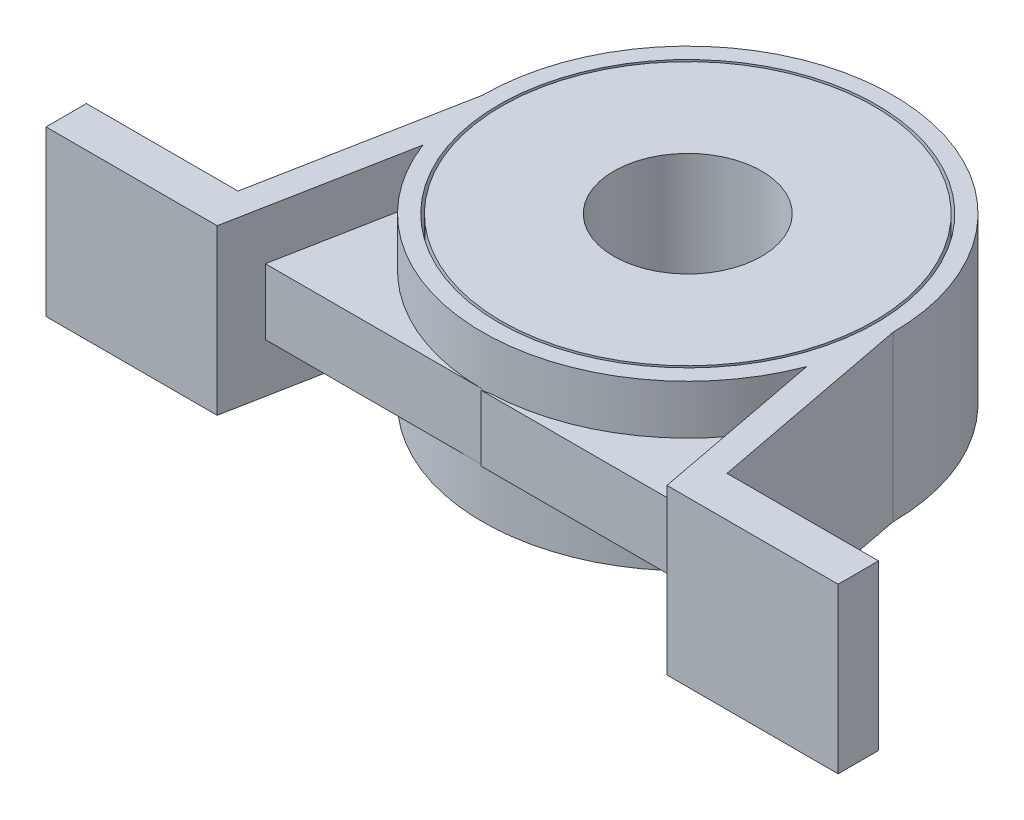
ISO-10303-21;
HEADER;
FILE_DESCRIPTION(('STEP AP214'),'2;1');
FILE_NAME('part.step','',(''),(''),'','','');
FILE_SCHEMA(('AUTOMOTIVE_DESIGN { 1 0 10303 214 1 1 1 1 }'));
ENDSEC;
DATA;
#1=APPLICATION_CONTEXT('core data for automotive mechanical design processes');
#2=APPLICATION_PROTOCOL_DEFINITION('international standard','automotive_design',2000,#1);
#3=PRODUCT_CONTEXT('',#1,'mechanical');
#4=PRODUCT('Part','Part','',(#3));
#5=PRODUCT_RELATED_PRODUCT_CATEGORY('part','',(#4));
#6=PRODUCT_DEFINITION_FORMATION('','',#4);
#7=PRODUCT_DEFINITION_CONTEXT('part definition',#1,'design');
#8=PRODUCT_DEFINITION('design','',#6,#7);
#9=PRODUCT_DEFINITION_SHAPE('','',#8);
#10=(LENGTH_UNIT() NAMED_UNIT(*) SI_UNIT(.MILLI.,.METRE.));
#11=(NAMED_UNIT(*) PLANE_ANGLE_UNIT() SI_UNIT($,.RADIAN.));
#12=(NAMED_UNIT(*) SI_UNIT($,.STERADIAN.) SOLID_ANGLE_UNIT());
#13=UNCERTAINTY_MEASURE_WITH_UNIT(LENGTH_MEASURE(1.E-05),#10,'distance_accuracy_value','');
#14=(GEOMETRIC_REPRESENTATION_CONTEXT(3) GLOBAL_UNCERTAINTY_ASSIGNED_CONTEXT((#13)) GLOBAL_UNIT_ASSIGNED_CONTEXT((#10,
#11,#12)) REPRESENTATION_CONTEXT('',''));
#15=CARTESIAN_POINT('',(0.,0.,0.));
#16=DIRECTION('',(0.,0.,1.));
#17=DIRECTION('',(1.,0.,0.));
#18=AXIS2_PLACEMENT_3D('',#15,#16,#17);
#19=CARTESIAN_POINT('',(0.,-5.,0.));
#20=DIRECTION('',(0.,1.,0.));
#21=DIRECTION('',(0.,0.,1.));
#22=AXIS2_PLACEMENT_3D('',#19,#20,#21);
#23=CYLINDRICAL_SURFACE('',#22,11.3415816445115);
#24=CARTESIAN_POINT('',(0.,-5.,0.));
#25=DIRECTION('',(0.,1.,0.));
#26=DIRECTION('',(0.,0.,1.));
#27=AXIS2_PLACEMENT_3D('',#24,#25,#26);
#28=CIRCLE('',#27,11.3415816445115);
#29=CARTESIAN_POINT('',(0.,-5.,11.3415816445115));
#30=VERTEX_POINT('',#29);
#31=EDGE_CURVE('E11',#30,#30,#28,.T.);
#32=ORIENTED_EDGE('',*,*,#31,.T.);
#33=EDGE_LOOP('',(#32));
#34=FACE_BOUND('',#33,.T.);
#35=CARTESIAN_POINT('',(0.,5.,0.));
#36=DIRECTION('',(0.,1.,0.));
#37=DIRECTION('',(0.,0.,1.));
#38=AXIS2_PLACEMENT_3D('',#35,#36,#37);
#39=CIRCLE('',#38,11.3415816445115);
#40=CARTESIAN_POINT('',(0.,5.,11.3415816445115));
#41=VERTEX_POINT('',#40);
#42=EDGE_CURVE('E56',#41,#41,#39,.T.);
#43=ORIENTED_EDGE('',*,*,#42,.F.);
#44=EDGE_LOOP('',(#43));
#45=FACE_BOUND('',#44,.T.);
#46=ADVANCED_FACE('F49',(#34,#45),#23,.T.);
#47=CARTESIAN_POINT('',(0.,-5.,0.));
#48=DIRECTION('',(0.,1.,0.));
#49=DIRECTION('',(0.,0.,1.));
#50=AXIS2_PLACEMENT_3D('',#47,#48,#49);
#51=PLANE('',#50);
#52=ORIENTED_EDGE('',*,*,#31,.F.);
#53=EDGE_LOOP('',(#52));
#54=FACE_BOUND('',#53,.T.);
#55=CARTESIAN_POINT('',(0.,-5.,0.));
#56=DIRECTION('',(0.,1.,0.));
#57=DIRECTION('',(0.,0.,1.));
#58=AXIS2_PLACEMENT_3D('',#55,#56,#57);
#59=CIRCLE('',#58,5.);
#60=CARTESIAN_POINT('',(0.,-5.,5.));
#61=VERTEX_POINT('',#60);
#62=EDGE_CURVE('E61',#61,#61,#59,.T.);
#63=ORIENTED_EDGE('',*,*,#62,.T.);
#64=EDGE_LOOP('',(#63));
#65=FACE_BOUND('',#64,.T.);
#66=ADVANCED_FACE('F86',(#54,#65),#51,.F.);
#67=CARTESIAN_POINT('',(0.,5.,0.));
#68=DIRECTION('',(0.,1.,0.));
#69=DIRECTION('',(0.,0.,1.));
#70=AXIS2_PLACEMENT_3D('',#67,#68,#69);
#71=PLANE('',#70);
#72=ORIENTED_EDGE('',*,*,#42,.T.);
#73=EDGE_LOOP('',(#72));
#74=FACE_BOUND('',#73,.T.);
#75=CARTESIAN_POINT('',(0.,5.,0.));
#76=DIRECTION('',(0.,1.,0.));
#77=DIRECTION('',(0.,0.,1.));
#78=AXIS2_PLACEMENT_3D('',#75,#76,#77);
#79=CIRCLE('',#78,4.5);
#80=CARTESIAN_POINT('',(0.,5.,4.5));
#81=VERTEX_POINT('',#80);
#82=EDGE_CURVE('E76',#81,#81,#79,.T.);
#83=ORIENTED_EDGE('',*,*,#82,.F.);
#84=EDGE_LOOP('',(#83));
#85=FACE_BOUND('',#84,.T.);
#86=ADVANCED_FACE('F83',(#74,#85),#71,.T.);
#87=CARTESIAN_POINT('',(0.,-8.,0.));
#88=DIRECTION('',(0.,1.,0.));
#89=DIRECTION('',(0.,0.,1.));
#90=AXIS2_PLACEMENT_3D('',#87,#88,#89);
#91=CYLINDRICAL_SURFACE('',#90,5.);
#92=CARTESIAN_POINT('',(0.,-8.,0.));
#93=DIRECTION('',(0.,1.,0.));
#94=DIRECTION('',(0.,0.,1.));
#95=AXIS2_PLACEMENT_3D('',#92,#93,#94);
#96=CIRCLE('',#95,5.);
#97=CARTESIAN_POINT('',(0.,-8.,5.));
#98=VERTEX_POINT('',#97);
#99=EDGE_CURVE('E66',#98,#98,#96,.T.);
#100=ORIENTED_EDGE('',*,*,#99,.T.);
#101=EDGE_LOOP('',(#100));
#102=FACE_BOUND('',#101,.T.);
#103=ORIENTED_EDGE('',*,*,#62,.F.);
#104=EDGE_LOOP('',(#103));
#105=FACE_BOUND('',#104,.T.);
#106=ADVANCED_FACE('F85',(#102,#105),#91,.T.);
#107=CARTESIAN_POINT('',(0.,-8.,0.));
#108=DIRECTION('',(0.,1.,0.));
#109=DIRECTION('',(0.,0.,1.));
#110=AXIS2_PLACEMENT_3D('',#107,#108,#109);
#111=PLANE('',#110);
#112=CARTESIAN_POINT('',(0.,-8.,0.));
#113=DIRECTION('',(0.,1.,0.));
#114=DIRECTION('',(0.,0.,1.));
#115=AXIS2_PLACEMENT_3D('',#112,#113,#114);
#116=CIRCLE('',#115,4.5);
#117=CARTESIAN_POINT('',(0.,-8.,4.5));
#118=VERTEX_POINT('',#117);
#119=EDGE_CURVE('E72',#118,#118,#116,.T.);
#120=ORIENTED_EDGE('',*,*,#119,.T.);
#121=EDGE_LOOP('',(#120));
#122=FACE_BOUND('',#121,.T.);
#123=ORIENTED_EDGE('',*,*,#99,.F.);
#124=EDGE_LOOP('',(#123));
#125=FACE_BOUND('',#124,.T.);
#126=ADVANCED_FACE('F92',(#122,#125),#111,.F.);
#127=CARTESIAN_POINT('',(0.,-8.,0.));
#128=DIRECTION('',(0.,1.,0.));
#129=DIRECTION('',(0.,0.,1.));
#130=AXIS2_PLACEMENT_3D('',#127,#128,#129);
#131=CYLINDRICAL_SURFACE('',#130,4.5);
#132=ORIENTED_EDGE('',*,*,#119,.F.);
#133=EDGE_LOOP('',(#132));
#134=FACE_BOUND('',#133,.T.);
#135=ORIENTED_EDGE('',*,*,#82,.T.);
#136=EDGE_LOOP('',(#135));
#137=FACE_BOUND('',#136,.T.);
#138=ADVANCED_FACE('F81',(#134,#137),#131,.F.);
#139=CLOSED_SHELL('',(#46,#66,#86,#106,#126,#138));
#140=MANIFOLD_SOLID_BREP('B2',#139);
#141=CARTESIAN_POINT('',(0.,-5.,0.));
#142=DIRECTION('',(0.,1.,0.));
#143=DIRECTION('',(0.,0.,1.));
#144=AXIS2_PLACEMENT_3D('',#141,#142,#143);
#145=CYLINDRICAL_SURFACE('',#144,12.5);
#146=CARTESIAN_POINT('',(0.,-2.,0.));
#147=DIRECTION('',(0.,-1.,0.));
#148=DIRECTION('',(0.,0.,-1.));
#149=AXIS2_PLACEMENT_3D('',#146,#147,#148);
#150=CIRCLE('',#149,12.5);
#151=CARTESIAN_POINT('',(0.526660373372982,-2.,12.4889002258453));
#152=VERTEX_POINT('',#151);
#153=CARTESIAN_POINT('',(11.5450602026166,-2.,4.79182480042409));
#154=VERTEX_POINT('',#153);
#155=EDGE_CURVE('E47',#152,#154,#150,.F.);
#156=ORIENTED_EDGE('',*,*,#155,.F.);
#157=DIRECTION('',(0.,1.,0.));
#158=VECTOR('',#157,1.);
#159=CARTESIAN_POINT('',(0.526660373372982,-2.,12.4889002258453));
#160=LINE('',#159,#158);
#161=CARTESIAN_POINT('',(0.526660373372982,2.,12.4889002258453));
#162=VERTEX_POINT('',#161);
#163=EDGE_CURVE('E492',#162,#152,#160,.F.);
#164=ORIENTED_EDGE('',*,*,#163,.F.);
#165=CARTESIAN_POINT('',(0.,2.,0.));
#166=DIRECTION('',(0.,-1.,0.));
#167=DIRECTION('',(0.,0.,-1.));
#168=AXIS2_PLACEMENT_3D('',#165,#166,#167);
#169=CIRCLE('',#168,12.5);
#170=CARTESIAN_POINT('',(11.5450602026166,2.,4.79182480042409));
#171=VERTEX_POINT('',#170);
#172=EDGE_CURVE('E465',#162,#171,#169,.F.);
#173=ORIENTED_EDGE('',*,*,#172,.T.);
#174=DIRECTION('',(0.,1.,0.));
#175=VECTOR('',#174,1.);
#176=CARTESIAN_POINT('',(11.5450602026166,-2.,4.79182480042409));
#177=LINE('',#176,#175);
#178=EDGE_CURVE('E164',#154,#171,#177,.T.);
#179=ORIENTED_EDGE('',*,*,#178,.F.);
#180=EDGE_LOOP('',(#156,#164,#173,#179));
#181=FACE_BOUND('',#180,.T.);
#182=DIRECTION('',(0.,1.,0.));
#183=VECTOR('',#182,1.);
#184=CARTESIAN_POINT('',(11.684129612312,-5.,4.44197199481196));
#185=LINE('',#184,#183);
#186=CARTESIAN_POINT('',(11.684129612312,-5.,4.44197199481196));
#187=VERTEX_POINT('',#186);
#188=CARTESIAN_POINT('',(11.684129612312,-2.,4.44197199481196));
#189=VERTEX_POINT('',#188);
#190=EDGE_CURVE('E474',#187,#189,#185,.T.);
#191=ORIENTED_EDGE('',*,*,#190,.T.);
#192=DIRECTION('',(0.,1.,0.));
#193=VECTOR('',#192,1.);
#194=CARTESIAN_POINT('',(11.684129612312,-2.,4.44197199481196));
#195=LINE('',#194,#193);
#196=CARTESIAN_POINT('',(11.684129612312,2.,4.44197199481196));
#197=VERTEX_POINT('',#196);
#198=EDGE_CURVE('E379',#189,#197,#195,.T.);
#199=ORIENTED_EDGE('',*,*,#198,.T.);
#200=CARTESIAN_POINT('',(11.684129612312,5.,4.44197199481196));
#201=VERTEX_POINT('',#200);
#202=EDGE_CURVE('E477',#197,#201,#185,.T.);
#203=ORIENTED_EDGE('',*,*,#202,.T.);
#204=CARTESIAN_POINT('',(0.,5.,0.));
#205=DIRECTION('',(0.,1.,0.));
#206=DIRECTION('',(0.,0.,1.));
#207=AXIS2_PLACEMENT_3D('',#204,#205,#206);
#208=CIRCLE('',#207,12.5);
#209=CARTESIAN_POINT('',(-11.684129612312,5.,4.44197199481197));
#210=VERTEX_POINT('',#209);
#211=EDGE_CURVE('E407',#210,#201,#208,.T.);
#212=ORIENTED_EDGE('',*,*,#211,.F.);
#213=DIRECTION('',(0.,1.,0.));
#214=VECTOR('',#213,1.);
#215=CARTESIAN_POINT('',(-11.684129612312,-5.,4.44197199481197));
#216=LINE('',#215,#214);
#217=CARTESIAN_POINT('',(-11.684129612312,2.,4.44197199481197));
#218=VERTEX_POINT('',#217);
#219=EDGE_CURVE('E480',#218,#210,#216,.T.);
#220=ORIENTED_EDGE('',*,*,#219,.F.);
#221=DIRECTION('',(0.,1.,0.));
#222=VECTOR('',#221,1.);
#223=CARTESIAN_POINT('',(-11.684129612312,-2.,4.44197199481197));
#224=LINE('',#223,#222);
#225=CARTESIAN_POINT('',(-11.684129612312,-2.,4.44197199481197));
#226=VERTEX_POINT('',#225);
#227=EDGE_CURVE('E307',#226,#218,#224,.T.);
#228=ORIENTED_EDGE('',*,*,#227,.F.);
#229=CARTESIAN_POINT('',(-11.684129612312,-5.,4.44197199481197));
#230=VERTEX_POINT('',#229);
#231=EDGE_CURVE('E478',#230,#226,#216,.T.);
#232=ORIENTED_EDGE('',*,*,#231,.F.);
#233=CARTESIAN_POINT('',(0.,-5.,0.));
#234=DIRECTION('',(0.,1.,0.));
#235=DIRECTION('',(0.,0.,1.));
#236=AXIS2_PLACEMENT_3D('',#233,#234,#235);
#237=CIRCLE('',#236,12.5);
#238=EDGE_CURVE('E445',#230,#187,#237,.T.);
#239=ORIENTED_EDGE('',*,*,#238,.T.);
#240=EDGE_LOOP('',(#191,#199,#203,#212,#220,#228,#232,#239));
#241=FACE_BOUND('',#240,.T.);
#242=DIRECTION('',(0.,1.,0.));
#243=VECTOR('',#242,1.);
#244=CARTESIAN_POINT('',(0.,-2.,12.5));
#245=LINE('',#244,#243);
#246=CARTESIAN_POINT('',(0.,-2.,12.5));
#247=VERTEX_POINT('',#246);
#248=CARTESIAN_POINT('',(0.,2.,12.5));
#249=VERTEX_POINT('',#248);
#250=EDGE_CURVE('E176',#247,#249,#245,.T.);
#251=ORIENTED_EDGE('',*,*,#250,.F.);
#252=CARTESIAN_POINT('',(0.,-2.,0.));
#253=DIRECTION('',(0.,1.,0.));
#254=DIRECTION('',(0.,0.,1.));
#255=AXIS2_PLACEMENT_3D('',#252,#253,#254);
#256=CIRCLE('',#255,12.5);
#257=CARTESIAN_POINT('',(-10.4298531818956,-2.,6.88971426142638));
#258=VERTEX_POINT('',#257);
#259=EDGE_CURVE('E171',#247,#258,#256,.F.);
#260=ORIENTED_EDGE('',*,*,#259,.T.);
#261=DIRECTION('',(0.,1.,0.));
#262=VECTOR('',#261,1.);
#263=CARTESIAN_POINT('',(-10.4298531818956,-2.,6.88971426142638));
#264=LINE('',#263,#262);
#265=CARTESIAN_POINT('',(-10.4298531818956,2.,6.88971426142638));
#266=VERTEX_POINT('',#265);
#267=EDGE_CURVE('E509',#266,#258,#264,.F.);
#268=ORIENTED_EDGE('',*,*,#267,.F.);
#269=CARTESIAN_POINT('',(0.,2.,0.));
#270=DIRECTION('',(0.,1.,0.));
#271=DIRECTION('',(0.,0.,1.));
#272=AXIS2_PLACEMENT_3D('',#269,#270,#271);
#273=CIRCLE('',#272,12.5);
#274=EDGE_CURVE('E579',#249,#266,#273,.F.);
#275=ORIENTED_EDGE('',*,*,#274,.F.);
#276=EDGE_LOOP('',(#251,#260,#268,#275));
#277=FACE_BOUND('',#276,.T.);
#278=ADVANCED_FACE('F156',(#181,#241,#277),#145,.T.);
#279=CARTESIAN_POINT('',(-13.6940376471734,-5.,14.9625156708185));
#280=DIRECTION('',(0.982235539022068,0.,0.187652193917438));
#281=DIRECTION('',(0.187652193917438,0.,-0.982235539022068));
#282=AXIS2_PLACEMENT_3D('',#279,#280,#281);
#283=PLANE('',#282);
#284=ORIENTED_EDGE('',*,*,#231,.T.);
#285=DIRECTION('',(-0.187652193917438,0.,0.982235539022068));
#286=VECTOR('',#285,1.);
#287=CARTESIAN_POINT('',(-13.2235838203395,-2.,12.5));
#288=LINE('',#287,#286);
#289=CARTESIAN_POINT('',(-13.2235838203395,-2.,12.5));
#290=VERTEX_POINT('',#289);
#291=EDGE_CURVE('E302',#226,#290,#288,.T.);
#292=ORIENTED_EDGE('',*,*,#291,.T.);
#293=DIRECTION('',(0.,1.,0.));
#294=VECTOR('',#293,1.);
#295=CARTESIAN_POINT('',(-13.2235838203395,-2.,12.5));
#296=LINE('',#295,#294);
#297=CARTESIAN_POINT('',(-13.2235838203395,2.,12.5));
#298=VERTEX_POINT('',#297);
#299=EDGE_CURVE('E295',#290,#298,#296,.T.);
#300=ORIENTED_EDGE('',*,*,#299,.T.);
#301=DIRECTION('',(-0.187652193917438,0.,0.982235539022068));
#302=VECTOR('',#301,1.);
#303=CARTESIAN_POINT('',(-13.2235838203395,2.,12.5));
#304=LINE('',#303,#302);
#305=EDGE_CURVE('E299',#218,#298,#304,.T.);
#306=ORIENTED_EDGE('',*,*,#305,.F.);
#307=ORIENTED_EDGE('',*,*,#219,.T.);
#308=DIRECTION('',(0.187652193917438,0.,-0.982235539022068));
#309=VECTOR('',#308,1.);
#310=CARTESIAN_POINT('',(-13.6940376471734,5.,14.9625156708185));
#311=LINE('',#310,#309);
#312=CARTESIAN_POINT('',(-13.6940376471734,5.,14.9625156708185));
#313=VERTEX_POINT('',#312);
#314=EDGE_CURVE('E404',#313,#210,#311,.T.);
#315=ORIENTED_EDGE('',*,*,#314,.F.);
#316=DIRECTION('',(0.,1.,0.));
#317=VECTOR('',#316,1.);
#318=CARTESIAN_POINT('',(-13.6940376471734,-5.,14.9625156708185));
#319=LINE('',#318,#317);
#320=CARTESIAN_POINT('',(-13.6940376471734,-5.,14.9625156708185));
#321=VERTEX_POINT('',#320);
#322=EDGE_CURVE('E481',#321,#313,#319,.T.);
#323=ORIENTED_EDGE('',*,*,#322,.F.);
#324=DIRECTION('',(0.187652193917438,0.,-0.982235539022068));
#325=VECTOR('',#324,1.);
#326=CARTESIAN_POINT('',(-13.6940376471734,-5.,14.9625156708185));
#327=LINE('',#326,#325);
#328=EDGE_CURVE('E442',#321,#230,#327,.T.);
#329=ORIENTED_EDGE('',*,*,#328,.T.);
#330=EDGE_LOOP('',(#284,#292,#300,#306,#307,#315,#323,#329));
#331=FACE_BOUND('',#330,.T.);
#332=ADVANCED_FACE('F298',(#331),#283,.T.);
#333=CARTESIAN_POINT('',(0.,-5.,0.));
#334=DIRECTION('',(0.,1.,0.));
#335=DIRECTION('',(0.,0.,1.));
#336=AXIS2_PLACEMENT_3D('',#333,#334,#335);
#337=CYLINDRICAL_SURFACE('',#336,12.5);
#338=DIRECTION('',(0.,1.,0.));
#339=VECTOR('',#338,1.);
#340=CARTESIAN_POINT('',(-12.5,-5.,0.));
#341=LINE('',#340,#339);
#342=CARTESIAN_POINT('',(-12.5,-5.,0.));
#343=VERTEX_POINT('',#342);
#344=CARTESIAN_POINT('',(-12.5,5.,0.));
#345=VERTEX_POINT('',#344);
#346=EDGE_CURVE('E462',#343,#345,#341,.T.);
#347=ORIENTED_EDGE('',*,*,#346,.T.);
#348=CARTESIAN_POINT('',(0.,5.,0.));
#349=DIRECTION('',(0.,1.,0.));
#350=DIRECTION('',(0.,0.,1.));
#351=AXIS2_PLACEMENT_3D('',#348,#349,#350);
#352=CIRCLE('',#351,12.5);
#353=CARTESIAN_POINT('',(12.5,5.,0.));
#354=VERTEX_POINT('',#353);
#355=EDGE_CURVE('E389',#354,#345,#352,.T.);
#356=ORIENTED_EDGE('',*,*,#355,.F.);
#357=DIRECTION('',(0.,1.,0.));
#358=VECTOR('',#357,1.);
#359=CARTESIAN_POINT('',(12.5,-5.,0.));
#360=LINE('',#359,#358);
#361=CARTESIAN_POINT('',(12.5,-5.,0.));
#362=VERTEX_POINT('',#361);
#363=EDGE_CURVE('E463',#362,#354,#360,.T.);
#364=ORIENTED_EDGE('',*,*,#363,.F.);
#365=CARTESIAN_POINT('',(0.,-5.,0.));
#366=DIRECTION('',(0.,1.,0.));
#367=DIRECTION('',(0.,0.,1.));
#368=AXIS2_PLACEMENT_3D('',#365,#366,#367);
#369=CIRCLE('',#368,12.5);
#370=EDGE_CURVE('E428',#362,#343,#369,.T.);
#371=ORIENTED_EDGE('',*,*,#370,.T.);
#372=EDGE_LOOP('',(#347,#356,#364,#371));
#373=FACE_BOUND('',#372,.T.);
#374=ADVANCED_FACE('F158',(#373),#337,.T.);
#375=CARTESIAN_POINT('',(12.5,-5.,0.));
#376=DIRECTION('',(0.982235539022068,0.,-0.187652193917437));
#377=DIRECTION('',(-0.187652193917437,0.,-0.982235539022068));
#378=AXIS2_PLACEMENT_3D('',#375,#376,#377);
#379=PLANE('',#378);
#380=ORIENTED_EDGE('',*,*,#363,.T.);
#381=DIRECTION('',(-0.187652193917437,0.,-0.982235539022068));
#382=VECTOR('',#381,1.);
#383=CARTESIAN_POINT('',(12.5,5.,0.));
#384=LINE('',#383,#382);
#385=CARTESIAN_POINT('',(14.8880752943468,5.,12.5));
#386=VERTEX_POINT('',#385);
#387=EDGE_CURVE('E422',#386,#354,#384,.T.);
#388=ORIENTED_EDGE('',*,*,#387,.F.);
#389=DIRECTION('',(0.,1.,0.));
#390=VECTOR('',#389,1.);
#391=CARTESIAN_POINT('',(14.8880752943468,-5.,12.5));
#392=LINE('',#391,#390);
#393=CARTESIAN_POINT('',(14.8880752943468,-5.,12.5));
#394=VERTEX_POINT('',#393);
#395=EDGE_CURVE('E466',#394,#386,#392,.T.);
#396=ORIENTED_EDGE('',*,*,#395,.F.);
#397=DIRECTION('',(-0.187652193917437,0.,-0.982235539022068));
#398=VECTOR('',#397,1.);
#399=CARTESIAN_POINT('',(12.5,-5.,0.));
#400=LINE('',#399,#398);
#401=EDGE_CURVE('E459',#394,#362,#400,.T.);
#402=ORIENTED_EDGE('',*,*,#401,.T.);
#403=EDGE_LOOP('',(#380,#388,#396,#402));
#404=FACE_BOUND('',#403,.T.);
#405=ADVANCED_FACE('F552',(#404),#379,.T.);
#406=CARTESIAN_POINT('',(14.8880752943468,-5.,12.5));
#407=DIRECTION('',(0.,0.,-1.));
#408=DIRECTION('',(-1.,0.,0.));
#409=AXIS2_PLACEMENT_3D('',#406,#407,#408);
#410=PLANE('',#409);
#411=ORIENTED_EDGE('',*,*,#395,.T.);
#412=DIRECTION('',(-1.,0.,0.));
#413=VECTOR('',#412,1.);
#414=CARTESIAN_POINT('',(14.8880752943468,5.,12.5));
#415=LINE('',#414,#413);
#416=CARTESIAN_POINT('',(24.1186819768417,5.,12.5));
#417=VERTEX_POINT('',#416);
#418=EDGE_CURVE('E419',#417,#386,#415,.T.);
#419=ORIENTED_EDGE('',*,*,#418,.F.);
#420=DIRECTION('',(0.,1.,0.));
#421=VECTOR('',#420,1.);
#422=CARTESIAN_POINT('',(24.1186819768417,-5.,12.5));
#423=LINE('',#422,#421);
#424=CARTESIAN_POINT('',(24.1186819768417,-5.,12.5));
#425=VERTEX_POINT('',#424);
#426=EDGE_CURVE('E468',#425,#417,#423,.T.);
#427=ORIENTED_EDGE('',*,*,#426,.F.);
#428=DIRECTION('',(-1.,0.,0.));
#429=VECTOR('',#428,1.);
#430=CARTESIAN_POINT('',(14.8880752943468,-5.,12.5));
#431=LINE('',#430,#429);
#432=EDGE_CURVE('E456',#425,#394,#431,.T.);
#433=ORIENTED_EDGE('',*,*,#432,.T.);
#434=EDGE_LOOP('',(#411,#419,#427,#433));
#435=FACE_BOUND('',#434,.T.);
#436=ADVANCED_FACE('F549',(#435),#410,.T.);
#437=CARTESIAN_POINT('',(24.1186819768417,-5.,12.5));
#438=DIRECTION('',(1.,0.,0.));
#439=DIRECTION('',(0.,0.,-1.));
#440=AXIS2_PLACEMENT_3D('',#437,#438,#439);
#441=PLANE('',#440);
#442=ORIENTED_EDGE('',*,*,#426,.T.);
#443=DIRECTION('',(0.,0.,-1.));
#444=VECTOR('',#443,1.);
#445=CARTESIAN_POINT('',(24.1186819768417,5.,12.5));
#446=LINE('',#445,#444);
#447=CARTESIAN_POINT('',(24.1186819768417,5.,14.9625156708185));
#448=VERTEX_POINT('',#447);
#449=EDGE_CURVE('E416',#448,#417,#446,.T.);
#450=ORIENTED_EDGE('',*,*,#449,.F.);
#451=DIRECTION('',(0.,1.,0.));
#452=VECTOR('',#451,1.);
#453=CARTESIAN_POINT('',(24.1186819768417,-5.,14.9625156708185));
#454=LINE('',#453,#452);
#455=CARTESIAN_POINT('',(24.1186819768417,-5.,14.9625156708185));
#456=VERTEX_POINT('',#455);
#457=EDGE_CURVE('E470',#456,#448,#454,.T.);
#458=ORIENTED_EDGE('',*,*,#457,.F.);
#459=DIRECTION('',(0.,0.,-1.));
#460=VECTOR('',#459,1.);
#461=CARTESIAN_POINT('',(24.1186819768417,-5.,12.5));
#462=LINE('',#461,#460);
#463=EDGE_CURVE('E453',#456,#425,#462,.T.);
#464=ORIENTED_EDGE('',*,*,#463,.T.);
#465=EDGE_LOOP('',(#442,#450,#458,#464));
#466=FACE_BOUND('',#465,.T.);
#467=ADVANCED_FACE('F543',(#466),#441,.T.);
#468=CARTESIAN_POINT('',(24.1186819768417,-5.,14.9625156708185));
#469=DIRECTION('',(0.,0.,1.));
#470=DIRECTION('',(1.,0.,0.));
#471=AXIS2_PLACEMENT_3D('',#468,#469,#470);
#472=PLANE('',#471);
#473=ORIENTED_EDGE('',*,*,#457,.T.);
#474=DIRECTION('',(1.,0.,0.));
#475=VECTOR('',#474,1.);
#476=CARTESIAN_POINT('',(13.6940376471734,5.,14.9625156708185));
#477=LINE('',#476,#475);
#478=CARTESIAN_POINT('',(13.6940376471734,5.,14.9625156708185));
#479=VERTEX_POINT('',#478);
#480=EDGE_CURVE('E413',#479,#448,#477,.T.);
#481=ORIENTED_EDGE('',*,*,#480,.F.);
#482=DIRECTION('',(0.,1.,0.));
#483=VECTOR('',#482,1.);
#484=CARTESIAN_POINT('',(13.6940376471734,-5.,14.9625156708185));
#485=LINE('',#484,#483);
#486=CARTESIAN_POINT('',(13.6940376471734,-5.,14.9625156708185));
#487=VERTEX_POINT('',#486);
#488=EDGE_CURVE('E472',#487,#479,#485,.T.);
#489=ORIENTED_EDGE('',*,*,#488,.F.);
#490=DIRECTION('',(1.,0.,0.));
#491=VECTOR('',#490,1.);
#492=CARTESIAN_POINT('',(13.6940376471734,-5.,14.9625156708185));
#493=LINE('',#492,#491);
#494=EDGE_CURVE('E451',#487,#456,#493,.T.);
#495=ORIENTED_EDGE('',*,*,#494,.T.);
#496=EDGE_LOOP('',(#473,#481,#489,#495));
#497=FACE_BOUND('',#496,.T.);
#498=ADVANCED_FACE('F539',(#497),#472,.T.);
#499=CARTESIAN_POINT('',(13.6940376471734,-5.,14.9625156708185));
#500=DIRECTION('',(-0.982235539022068,0.,0.187652193917438));
#501=DIRECTION('',(0.187652193917438,0.,0.982235539022068));
#502=AXIS2_PLACEMENT_3D('',#499,#500,#501);
#503=PLANE('',#502);
#504=DIRECTION('',(-0.187652193917437,0.,-0.982235539022068));
#505=VECTOR('',#504,1.);
#506=CARTESIAN_POINT('',(13.2434723544538,-2.,12.6041033660106));
#507=LINE('',#506,#505);
#508=CARTESIAN_POINT('',(13.2434723544538,-2.,12.6041033660106));
#509=VERTEX_POINT('',#508);
#510=EDGE_CURVE('E375',#509,#189,#507,.T.);
#511=ORIENTED_EDGE('',*,*,#510,.T.);
#512=ORIENTED_EDGE('',*,*,#190,.F.);
#513=DIRECTION('',(0.187652193917438,0.,0.982235539022068));
#514=VECTOR('',#513,1.);
#515=CARTESIAN_POINT('',(13.6940376471734,-5.,14.9625156708185));
#516=LINE('',#515,#514);
#517=EDGE_CURVE('E448',#187,#487,#516,.T.);
#518=ORIENTED_EDGE('',*,*,#517,.T.);
#519=ORIENTED_EDGE('',*,*,#488,.T.);
#520=DIRECTION('',(0.187652193917438,0.,0.982235539022068));
#521=VECTOR('',#520,1.);
#522=CARTESIAN_POINT('',(13.6940376471734,5.,14.9625156708185));
#523=LINE('',#522,#521);
#524=EDGE_CURVE('E410',#201,#479,#523,.T.);
#525=ORIENTED_EDGE('',*,*,#524,.F.);
#526=ORIENTED_EDGE('',*,*,#202,.F.);
#527=DIRECTION('',(-0.187652193917437,0.,-0.982235539022068));
#528=VECTOR('',#527,1.);
#529=CARTESIAN_POINT('',(13.2434723544538,2.,12.6041033660106));
#530=LINE('',#529,#528);
#531=CARTESIAN_POINT('',(13.2434723544538,2.,12.6041033660106));
#532=VERTEX_POINT('',#531);
#533=EDGE_CURVE('E369',#532,#197,#530,.T.);
#534=ORIENTED_EDGE('',*,*,#533,.F.);
#535=DIRECTION('',(0.,1.,0.));
#536=VECTOR('',#535,1.);
#537=CARTESIAN_POINT('',(13.2434723544538,-2.,12.6041033660106));
#538=LINE('',#537,#536);
#539=EDGE_CURVE('E383',#509,#532,#538,.T.);
#540=ORIENTED_EDGE('',*,*,#539,.F.);
#541=EDGE_LOOP('',(#511,#512,#518,#519,#525,#526,#534,#540));
#542=FACE_BOUND('',#541,.T.);
#543=ADVANCED_FACE('F525',(#542),#503,.T.);
#544=CARTESIAN_POINT('',(-14.8880752943468,-5.,14.9625156708185));
#545=DIRECTION('',(0.,0.,1.));
#546=DIRECTION('',(1.,0.,0.));
#547=AXIS2_PLACEMENT_3D('',#544,#545,#546);
#548=PLANE('',#547);
#549=ORIENTED_EDGE('',*,*,#322,.T.);
#550=DIRECTION('',(1.,0.,0.));
#551=VECTOR('',#550,1.);
#552=CARTESIAN_POINT('',(-24.1186819768417,5.,14.9625156708185));
#553=LINE('',#552,#551);
#554=CARTESIAN_POINT('',(-24.1186819768417,5.,14.9625156708185));
#555=VERTEX_POINT('',#554);
#556=EDGE_CURVE('E401',#555,#313,#553,.T.);
#557=ORIENTED_EDGE('',*,*,#556,.F.);
#558=DIRECTION('',(0.,1.,0.));
#559=VECTOR('',#558,1.);
#560=CARTESIAN_POINT('',(-24.1186819768417,-5.,14.9625156708185));
#561=LINE('',#560,#559);
#562=CARTESIAN_POINT('',(-24.1186819768417,-5.,14.9625156708185));
#563=VERTEX_POINT('',#562);
#564=EDGE_CURVE('E483',#563,#555,#561,.T.);
#565=ORIENTED_EDGE('',*,*,#564,.F.);
#566=DIRECTION('',(1.,0.,0.));
#567=VECTOR('',#566,1.);
#568=CARTESIAN_POINT('',(-24.1186819768417,-5.,14.9625156708185));
#569=LINE('',#568,#567);
#570=EDGE_CURVE('E440',#563,#321,#569,.T.);
#571=ORIENTED_EDGE('',*,*,#570,.T.);
#572=EDGE_LOOP('',(#549,#557,#565,#571));
#573=FACE_BOUND('',#572,.T.);
#574=ADVANCED_FACE('F570',(#573),#548,.T.);
#575=CARTESIAN_POINT('',(-24.1186819768417,-5.,12.5));
#576=DIRECTION('',(-1.,0.,0.));
#577=DIRECTION('',(0.,0.,1.));
#578=AXIS2_PLACEMENT_3D('',#575,#576,#577);
#579=PLANE('',#578);
#580=ORIENTED_EDGE('',*,*,#564,.T.);
#581=DIRECTION('',(0.,0.,1.));
#582=VECTOR('',#581,1.);
#583=CARTESIAN_POINT('',(-24.1186819768417,5.,12.5));
#584=LINE('',#583,#582);
#585=CARTESIAN_POINT('',(-24.1186819768417,5.,12.5));
#586=VERTEX_POINT('',#585);
#587=EDGE_CURVE('E398',#586,#555,#584,.T.);
#588=ORIENTED_EDGE('',*,*,#587,.F.);
#589=DIRECTION('',(0.,1.,0.));
#590=VECTOR('',#589,1.);
#591=CARTESIAN_POINT('',(-24.1186819768417,-5.,12.5));
#592=LINE('',#591,#590);
#593=CARTESIAN_POINT('',(-24.1186819768417,-5.,12.5));
#594=VERTEX_POINT('',#593);
#595=EDGE_CURVE('E485',#594,#586,#592,.T.);
#596=ORIENTED_EDGE('',*,*,#595,.F.);
#597=DIRECTION('',(0.,0.,1.));
#598=VECTOR('',#597,1.);
#599=CARTESIAN_POINT('',(-24.1186819768417,-5.,12.5));
#600=LINE('',#599,#598);
#601=EDGE_CURVE('E437',#594,#563,#600,.T.);
#602=ORIENTED_EDGE('',*,*,#601,.T.);
#603=EDGE_LOOP('',(#580,#588,#596,#602));
#604=FACE_BOUND('',#603,.T.);
#605=ADVANCED_FACE('F566',(#604),#579,.T.);
#606=CARTESIAN_POINT('',(-14.8880752943468,-5.,12.5));
#607=DIRECTION('',(0.,0.,-1.));
#608=DIRECTION('',(-1.,0.,0.));
#609=AXIS2_PLACEMENT_3D('',#606,#607,#608);
#610=PLANE('',#609);
#611=ORIENTED_EDGE('',*,*,#595,.T.);
#612=DIRECTION('',(-1.,0.,0.));
#613=VECTOR('',#612,1.);
#614=CARTESIAN_POINT('',(-14.8880752943468,5.,12.5));
#615=LINE('',#614,#613);
#616=CARTESIAN_POINT('',(-14.8880752943468,5.,12.5));
#617=VERTEX_POINT('',#616);
#618=EDGE_CURVE('E395',#617,#586,#615,.T.);
#619=ORIENTED_EDGE('',*,*,#618,.F.);
#620=DIRECTION('',(0.,1.,0.));
#621=VECTOR('',#620,1.);
#622=CARTESIAN_POINT('',(-14.8880752943468,-5.,12.5));
#623=LINE('',#622,#621);
#624=CARTESIAN_POINT('',(-14.8880752943468,-5.,12.5));
#625=VERTEX_POINT('',#624);
#626=EDGE_CURVE('E487',#625,#617,#623,.T.);
#627=ORIENTED_EDGE('',*,*,#626,.F.);
#628=DIRECTION('',(-1.,0.,0.));
#629=VECTOR('',#628,1.);
#630=CARTESIAN_POINT('',(-14.8880752943468,-5.,12.5));
#631=LINE('',#630,#629);
#632=EDGE_CURVE('E434',#625,#594,#631,.T.);
#633=ORIENTED_EDGE('',*,*,#632,.T.);
#634=EDGE_LOOP('',(#611,#619,#627,#633));
#635=FACE_BOUND('',#634,.T.);
#636=ADVANCED_FACE('F562',(#635),#610,.T.);
#637=CARTESIAN_POINT('',(-12.5,-5.,0.));
#638=DIRECTION('',(-0.982235539022068,0.,-0.187652193917437));
#639=DIRECTION('',(-0.187652193917437,0.,0.982235539022068));
#640=AXIS2_PLACEMENT_3D('',#637,#638,#639);
#641=PLANE('',#640);
#642=ORIENTED_EDGE('',*,*,#626,.T.);
#643=DIRECTION('',(-0.187652193917437,0.,0.982235539022068));
#644=VECTOR('',#643,1.);
#645=CARTESIAN_POINT('',(-12.5,5.,0.));
#646=LINE('',#645,#644);
#647=EDGE_CURVE('E392',#345,#617,#646,.T.);
#648=ORIENTED_EDGE('',*,*,#647,.F.);
#649=ORIENTED_EDGE('',*,*,#346,.F.);
#650=DIRECTION('',(-0.187652193917437,0.,0.982235539022068));
#651=VECTOR('',#650,1.);
#652=CARTESIAN_POINT('',(-12.5,-5.,0.));
#653=LINE('',#652,#651);
#654=EDGE_CURVE('E431',#343,#625,#653,.T.);
#655=ORIENTED_EDGE('',*,*,#654,.T.);
#656=EDGE_LOOP('',(#642,#648,#649,#655));
#657=FACE_BOUND('',#656,.T.);
#658=ADVANCED_FACE('F558',(#657),#641,.T.);
#659=CARTESIAN_POINT('',(0.,-5.,0.));
#660=DIRECTION('',(0.,1.,0.));
#661=DIRECTION('',(0.,0.,1.));
#662=AXIS2_PLACEMENT_3D('',#659,#660,#661);
#663=PLANE('',#662);
#664=CARTESIAN_POINT('',(0.,-5.,0.));
#665=DIRECTION('',(0.,1.,0.));
#666=DIRECTION('',(0.,0.,1.));
#667=AXIS2_PLACEMENT_3D('',#664,#665,#666);
#668=CIRCLE('',#667,11.5);
#669=CARTESIAN_POINT('',(0.,-5.,11.5));
#670=VERTEX_POINT('',#669);
#671=EDGE_CURVE('E425',#670,#670,#668,.T.);
#672=ORIENTED_EDGE('',*,*,#671,.T.);
#673=EDGE_LOOP('',(#672));
#674=FACE_BOUND('',#673,.T.);
#675=ORIENTED_EDGE('',*,*,#370,.F.);
#676=ORIENTED_EDGE('',*,*,#401,.F.);
#677=ORIENTED_EDGE('',*,*,#432,.F.);
#678=ORIENTED_EDGE('',*,*,#463,.F.);
#679=ORIENTED_EDGE('',*,*,#494,.F.);
#680=ORIENTED_EDGE('',*,*,#517,.F.);
#681=ORIENTED_EDGE('',*,*,#238,.F.);
#682=ORIENTED_EDGE('',*,*,#328,.F.);
#683=ORIENTED_EDGE('',*,*,#570,.F.);
#684=ORIENTED_EDGE('',*,*,#601,.F.);
#685=ORIENTED_EDGE('',*,*,#632,.F.);
#686=ORIENTED_EDGE('',*,*,#654,.F.);
#687=EDGE_LOOP('',(#675,#676,#677,#678,#679,#680,#681,#682,#683,#684,#685,#686));
#688=FACE_BOUND('',#687,.T.);
#689=ADVANCED_FACE('F533',(#674,#688),#663,.F.);
#690=CARTESIAN_POINT('',(0.,-5.,0.));
#691=DIRECTION('',(0.,1.,0.));
#692=DIRECTION('',(0.,0.,1.));
#693=AXIS2_PLACEMENT_3D('',#690,#691,#692);
#694=CYLINDRICAL_SURFACE('',#693,11.5);
#695=ORIENTED_EDGE('',*,*,#671,.F.);
#696=EDGE_LOOP('',(#695));
#697=FACE_BOUND('',#696,.T.);
#698=CARTESIAN_POINT('',(0.,5.,0.));
#699=DIRECTION('',(0.,1.,0.));
#700=DIRECTION('',(0.,0.,1.));
#701=AXIS2_PLACEMENT_3D('',#698,#699,#700);
#702=CIRCLE('',#701,11.5);
#703=CARTESIAN_POINT('',(0.,5.,11.5));
#704=VERTEX_POINT('',#703);
#705=EDGE_CURVE('E382',#704,#704,#702,.T.);
#706=ORIENTED_EDGE('',*,*,#705,.T.);
#707=EDGE_LOOP('',(#706));
#708=FACE_BOUND('',#707,.T.);
#709=ADVANCED_FACE('F604',(#697,#708),#694,.F.);
#710=CARTESIAN_POINT('',(0.,5.,0.));
#711=DIRECTION('',(0.,1.,0.));
#712=DIRECTION('',(0.,0.,1.));
#713=AXIS2_PLACEMENT_3D('',#710,#711,#712);
#714=PLANE('',#713);
#715=ORIENTED_EDGE('',*,*,#355,.T.);
#716=ORIENTED_EDGE('',*,*,#647,.T.);
#717=ORIENTED_EDGE('',*,*,#618,.T.);
#718=ORIENTED_EDGE('',*,*,#587,.T.);
#719=ORIENTED_EDGE('',*,*,#556,.T.);
#720=ORIENTED_EDGE('',*,*,#314,.T.);
#721=ORIENTED_EDGE('',*,*,#211,.T.);
#722=ORIENTED_EDGE('',*,*,#524,.T.);
#723=ORIENTED_EDGE('',*,*,#480,.T.);
#724=ORIENTED_EDGE('',*,*,#449,.T.);
#725=ORIENTED_EDGE('',*,*,#418,.T.);
#726=ORIENTED_EDGE('',*,*,#387,.T.);
#727=EDGE_LOOP('',(#715,#716,#717,#718,#719,#720,#721,#722,#723,#724,#725,#726));
#728=FACE_BOUND('',#727,.T.);
#729=ORIENTED_EDGE('',*,*,#705,.F.);
#730=EDGE_LOOP('',(#729));
#731=FACE_BOUND('',#730,.T.);
#732=ADVANCED_FACE('F358',(#728,#731),#714,.T.);
#733=CARTESIAN_POINT('',(11.684129612312,-2.,4.44197199481196));
#734=CARTESIAN_POINT('',(9.34308117346182,-2.,10.6425719217414));
#735=CARTESIAN_POINT('',(0.,-2.,12.6041033660106));
#736=B_SPLINE_CURVE_WITH_KNOTS('',2,(#733,#734,#735),.UNSPECIFIED.,.F.,.F.,(3,3),(0.,
0.709533534474115),.UNSPECIFIED.);
#737=DIRECTION('',(0.,1.,0.));
#738=VECTOR('',#737,1.);
#739=SURFACE_OF_LINEAR_EXTRUSION('',#736,#738);
#740=EDGE_CURVE('E360',#189,#154,#736,.T.);
#741=ORIENTED_EDGE('',*,*,#740,.T.);
#742=ORIENTED_EDGE('',*,*,#178,.T.);
#743=CARTESIAN_POINT('',(11.684129612312,2.,4.44197199481196));
#744=CARTESIAN_POINT('',(9.34308117346182,2.,10.6425719217414));
#745=CARTESIAN_POINT('',(0.,2.,12.6041033660106));
#746=B_SPLINE_CURVE_WITH_KNOTS('',2,(#743,#744,#745),.UNSPECIFIED.,.F.,.F.,(3,3),(0.,
0.709533534474115),.UNSPECIFIED.);
#747=EDGE_CURVE('E496',#197,#171,#746,.T.);
#748=ORIENTED_EDGE('',*,*,#747,.F.);
#749=ORIENTED_EDGE('',*,*,#198,.F.);
#750=EDGE_LOOP('',(#741,#742,#748,#749));
#751=FACE_BOUND('',#750,.T.);
#752=ADVANCED_FACE('F356',(#751),#739,.T.);
#753=CARTESIAN_POINT('',(0.,2.,12.6041033660106));
#754=VERTEX_POINT('',#753);
#755=EDGE_CURVE('E505',#162,#754,#746,.T.);
#756=ORIENTED_EDGE('',*,*,#755,.F.);
#757=ORIENTED_EDGE('',*,*,#163,.T.);
#758=CARTESIAN_POINT('',(0.,-2.,12.6041033660106));
#759=VERTEX_POINT('',#758);
#760=EDGE_CURVE('E368',#152,#759,#736,.T.);
#761=ORIENTED_EDGE('',*,*,#760,.T.);
#762=DIRECTION('',(0.,1.,0.));
#763=VECTOR('',#762,1.);
#764=CARTESIAN_POINT('',(0.,-2.,12.6041033660106));
#765=LINE('',#764,#763);
#766=EDGE_CURVE('E378',#759,#754,#765,.T.);
#767=ORIENTED_EDGE('',*,*,#766,.T.);
#768=EDGE_LOOP('',(#756,#757,#761,#767));
#769=FACE_BOUND('',#768,.T.);
#770=ADVANCED_FACE('F351',(#769),#739,.T.);
#771=CARTESIAN_POINT('',(0.,-2.,12.6041033660106));
#772=DIRECTION('',(0.,0.,1.));
#773=DIRECTION('',(1.,0.,0.));
#774=AXIS2_PLACEMENT_3D('',#771,#772,#773);
#775=PLANE('',#774);
#776=ORIENTED_EDGE('',*,*,#539,.T.);
#777=DIRECTION('',(1.,0.,0.));
#778=VECTOR('',#777,1.);
#779=CARTESIAN_POINT('',(0.,2.,12.6041033660106));
#780=LINE('',#779,#778);
#781=EDGE_CURVE('E511',#754,#532,#780,.T.);
#782=ORIENTED_EDGE('',*,*,#781,.F.);
#783=ORIENTED_EDGE('',*,*,#766,.F.);
#784=DIRECTION('',(1.,0.,0.));
#785=VECTOR('',#784,1.);
#786=CARTESIAN_POINT('',(0.,-2.,12.6041033660106));
#787=LINE('',#786,#785);
#788=EDGE_CURVE('E367',#759,#509,#787,.T.);
#789=ORIENTED_EDGE('',*,*,#788,.T.);
#790=EDGE_LOOP('',(#776,#782,#783,#789));
#791=FACE_BOUND('',#790,.T.);
#792=ADVANCED_FACE('F347',(#791),#775,.T.);
#793=CARTESIAN_POINT('',(7.59257298980891,-2.,9.58280480107636));
#794=DIRECTION('',(0.,-1.,0.));
#795=DIRECTION('',(0.,0.,-1.));
#796=AXIS2_PLACEMENT_3D('',#793,#794,#795);
#797=PLANE('',#796);
#798=ORIENTED_EDGE('',*,*,#760,.F.);
#799=ORIENTED_EDGE('',*,*,#155,.T.);
#800=ORIENTED_EDGE('',*,*,#740,.F.);
#801=ORIENTED_EDGE('',*,*,#510,.F.);
#802=ORIENTED_EDGE('',*,*,#788,.F.);
#803=EDGE_LOOP('',(#798,#799,#800,#801,#802));
#804=FACE_BOUND('',#803,.T.);
#805=ADVANCED_FACE('F343',(#804),#797,.T.);
#806=CARTESIAN_POINT('',(7.59257298980891,2.,9.58280480107636));
#807=DIRECTION('',(0.,-1.,0.));
#808=DIRECTION('',(0.,0.,-1.));
#809=AXIS2_PLACEMENT_3D('',#806,#807,#808);
#810=PLANE('',#809);
#811=ORIENTED_EDGE('',*,*,#172,.F.);
#812=ORIENTED_EDGE('',*,*,#755,.T.);
#813=ORIENTED_EDGE('',*,*,#781,.T.);
#814=ORIENTED_EDGE('',*,*,#533,.T.);
#815=ORIENTED_EDGE('',*,*,#747,.T.);
#816=EDGE_LOOP('',(#811,#812,#813,#814,#815));
#817=FACE_BOUND('',#816,.T.);
#818=ADVANCED_FACE('F338',(#817),#810,.F.);
#819=CARTESIAN_POINT('',(0.,-2.,12.5));
#820=CARTESIAN_POINT('',(-9.4204769381332,-2.,10.800220506542));
#821=CARTESIAN_POINT('',(-11.684129612312,-2.,4.44197199481197));
#822=B_SPLINE_CURVE_WITH_KNOTS('',2,(#819,#820,#821),.UNSPECIFIED.,.F.,.F.,(3,3),(0.,
0.791193811758237),.UNSPECIFIED.);
#823=DIRECTION('',(0.,1.,0.));
#824=VECTOR('',#823,1.);
#825=SURFACE_OF_LINEAR_EXTRUSION('',#822,#824);
#826=CARTESIAN_POINT('',(0.,2.,12.5));
#827=CARTESIAN_POINT('',(-9.4204769381332,2.,10.800220506542));
#828=CARTESIAN_POINT('',(-11.684129612312,2.,4.44197199481197));
#829=B_SPLINE_CURVE_WITH_KNOTS('',2,(#826,#827,#828),.UNSPECIFIED.,.F.,.F.,(3,3),(0.,
0.791193811758237),.UNSPECIFIED.);
#830=EDGE_CURVE('E316',#266,#218,#829,.T.);
#831=ORIENTED_EDGE('',*,*,#830,.F.);
#832=ORIENTED_EDGE('',*,*,#267,.T.);
#833=EDGE_CURVE('E320',#258,#226,#822,.T.);
#834=ORIENTED_EDGE('',*,*,#833,.T.);
#835=ORIENTED_EDGE('',*,*,#227,.T.);
#836=EDGE_LOOP('',(#831,#832,#834,#835));
#837=FACE_BOUND('',#836,.T.);
#838=ADVANCED_FACE('F334',(#837),#825,.T.);
#839=CARTESIAN_POINT('',(0.,-2.,12.5));
#840=DIRECTION('',(0.,0.,1.));
#841=DIRECTION('',(1.,0.,0.));
#842=AXIS2_PLACEMENT_3D('',#839,#840,#841);
#843=PLANE('',#842);
#844=ORIENTED_EDGE('',*,*,#250,.T.);
#845=DIRECTION('',(1.,0.,0.));
#846=VECTOR('',#845,1.);
#847=CARTESIAN_POINT('',(0.,2.,12.5));
#848=LINE('',#847,#846);
#849=EDGE_CURVE('E314',#298,#249,#848,.T.);
#850=ORIENTED_EDGE('',*,*,#849,.F.);
#851=ORIENTED_EDGE('',*,*,#299,.F.);
#852=DIRECTION('',(1.,0.,0.));
#853=VECTOR('',#852,1.);
#854=CARTESIAN_POINT('',(0.,-2.,12.5));
#855=LINE('',#854,#853);
#856=EDGE_CURVE('E573',#290,#247,#855,.T.);
#857=ORIENTED_EDGE('',*,*,#856,.T.);
#858=EDGE_LOOP('',(#844,#850,#851,#857));
#859=FACE_BOUND('',#858,.T.);
#860=ADVANCED_FACE('F319',(#859),#843,.T.);
#861=CARTESIAN_POINT('',(-7.6312708721446,-2.,9.63560325197401));
#862=DIRECTION('',(0.,1.,0.));
#863=DIRECTION('',(0.,0.,1.));
#864=AXIS2_PLACEMENT_3D('',#861,#862,#863);
#865=PLANE('',#864);
#866=ORIENTED_EDGE('',*,*,#259,.F.);
#867=ORIENTED_EDGE('',*,*,#856,.F.);
#868=ORIENTED_EDGE('',*,*,#291,.F.);
#869=ORIENTED_EDGE('',*,*,#833,.F.);
#870=EDGE_LOOP('',(#866,#867,#868,#869));
#871=FACE_BOUND('',#870,.T.);
#872=ADVANCED_FACE('F577',(#871),#865,.F.);
#873=CARTESIAN_POINT('',(-7.6312708721446,2.,9.63560325197401));
#874=DIRECTION('',(0.,1.,0.));
#875=DIRECTION('',(0.,0.,1.));
#876=AXIS2_PLACEMENT_3D('',#873,#874,#875);
#877=PLANE('',#876);
#878=ORIENTED_EDGE('',*,*,#849,.T.);
#879=ORIENTED_EDGE('',*,*,#274,.T.);
#880=ORIENTED_EDGE('',*,*,#830,.T.);
#881=ORIENTED_EDGE('',*,*,#305,.T.);
#882=EDGE_LOOP('',(#878,#879,#880,#881));
#883=FACE_BOUND('',#882,.T.);
#884=ADVANCED_FACE('F312',(#883),#877,.T.);
#885=CLOSED_SHELL('',(#278,#332,#374,#405,#436,#467,#498,#543,#574,#605,#636,#658,#689,#709,
#732,#752,#770,#792,#805,#818,#838,#860,#872,#884));
#886=MANIFOLD_SOLID_BREP('B6',#885);
#887=ADVANCED_BREP_SHAPE_REPRESENTATION('',(#18,#140,#886),#14);
#888=SHAPE_DEFINITION_REPRESENTATION(#9,#887);
ENDSEC;
END-ISO-10303-21;
